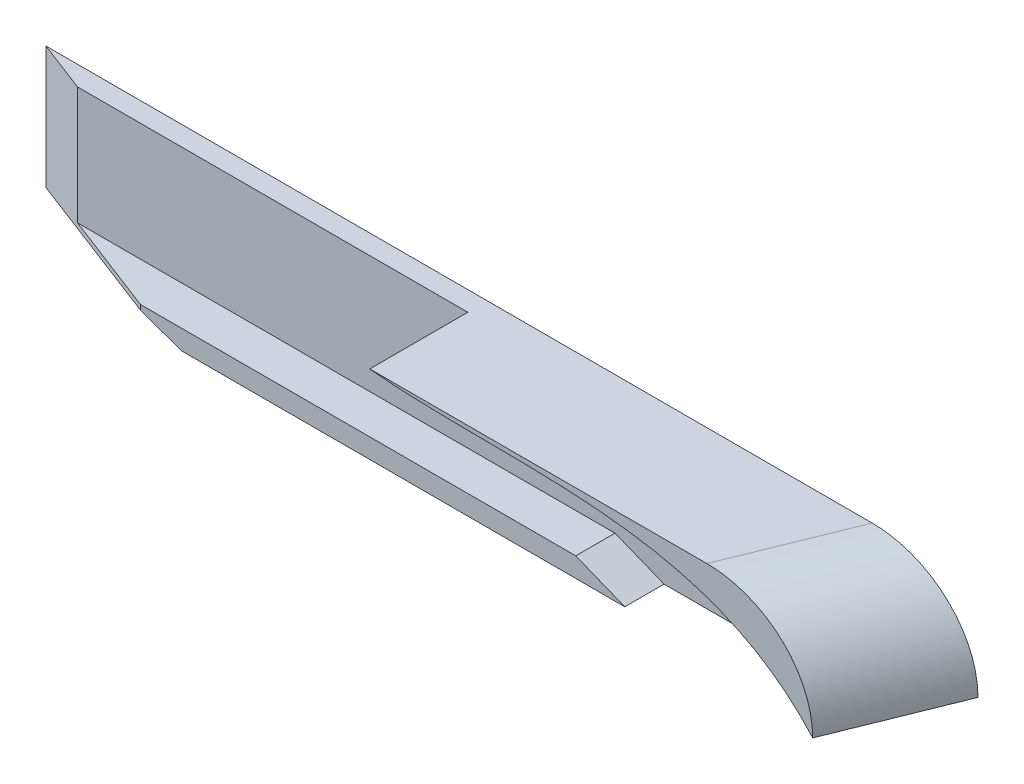
ISO-10303-21;
HEADER;
FILE_DESCRIPTION(('STEP AP214'),'2;1');
FILE_NAME('part.step','',(''),(''),'','','');
FILE_SCHEMA(('AUTOMOTIVE_DESIGN { 1 0 10303 214 1 1 1 1 }'));
ENDSEC;
DATA;
#1=APPLICATION_CONTEXT('core data for automotive mechanical design processes');
#2=APPLICATION_PROTOCOL_DEFINITION('international standard','automotive_design',2000,#1);
#3=PRODUCT_CONTEXT('',#1,'mechanical');
#4=PRODUCT('Part','Part','',(#3));
#5=PRODUCT_RELATED_PRODUCT_CATEGORY('part','',(#4));
#6=PRODUCT_DEFINITION_FORMATION('','',#4);
#7=PRODUCT_DEFINITION_CONTEXT('part definition',#1,'design');
#8=PRODUCT_DEFINITION('design','',#6,#7);
#9=PRODUCT_DEFINITION_SHAPE('','',#8);
#10=(LENGTH_UNIT() NAMED_UNIT(*) SI_UNIT(.MILLI.,.METRE.));
#11=(NAMED_UNIT(*) PLANE_ANGLE_UNIT() SI_UNIT($,.RADIAN.));
#12=(NAMED_UNIT(*) SI_UNIT($,.STERADIAN.) SOLID_ANGLE_UNIT());
#13=UNCERTAINTY_MEASURE_WITH_UNIT(LENGTH_MEASURE(1.E-05),#10,'distance_accuracy_value','');
#14=(GEOMETRIC_REPRESENTATION_CONTEXT(3) GLOBAL_UNCERTAINTY_ASSIGNED_CONTEXT((#13)) GLOBAL_UNIT_ASSIGNED_CONTEXT((#10,
#11,#12)) REPRESENTATION_CONTEXT('',''));
#15=CARTESIAN_POINT('',(0.,0.,0.));
#16=DIRECTION('',(0.,0.,1.));
#17=DIRECTION('',(1.,0.,0.));
#18=AXIS2_PLACEMENT_3D('',#15,#16,#17);
#19=CARTESIAN_POINT('',(32.9411764705883,11.906862745098,2.));
#20=DIRECTION('',(-1.,0.,0.));
#21=DIRECTION('',(0.,0.,1.));
#22=AXIS2_PLACEMENT_3D('',#19,#20,#21);
#23=PLANE('',#22);
#24=DIRECTION('',(0.,0.,-1.));
#25=VECTOR('',#24,1.);
#26=CARTESIAN_POINT('',(32.9411764705883,1.90686274509804,2.));
#27=LINE('',#26,#25);
#28=CARTESIAN_POINT('',(32.9411764705883,1.90686274509804,2.));
#29=VERTEX_POINT('',#28);
#30=CARTESIAN_POINT('',(32.9411764705883,1.90686274509804,0.));
#31=VERTEX_POINT('',#30);
#32=EDGE_CURVE('E171',#29,#31,#27,.T.);
#33=ORIENTED_EDGE('',*,*,#32,.F.);
#34=DIRECTION('',(0.,1.,0.));
#35=VECTOR('',#34,1.);
#36=CARTESIAN_POINT('',(32.9411764705883,11.906862745098,2.));
#37=LINE('',#36,#35);
#38=CARTESIAN_POINT('',(32.9411764705883,-2.09313725490196,2.));
#39=VERTEX_POINT('',#38);
#40=EDGE_CURVE('E132',#39,#29,#37,.T.);
#41=ORIENTED_EDGE('',*,*,#40,.F.);
#42=DIRECTION('',(0.,0.,-1.));
#43=VECTOR('',#42,1.);
#44=CARTESIAN_POINT('',(32.9411764705883,-2.09313725490196,2.));
#45=LINE('',#44,#43);
#46=CARTESIAN_POINT('',(32.9411764705883,-2.09313725490196,0.));
#47=VERTEX_POINT('',#46);
#48=EDGE_CURVE('E198',#39,#47,#45,.T.);
#49=ORIENTED_EDGE('',*,*,#48,.T.);
#50=DIRECTION('',(0.,1.,0.));
#51=VECTOR('',#50,1.);
#52=CARTESIAN_POINT('',(32.9411764705883,11.906862745098,0.));
#53=LINE('',#52,#51);
#54=EDGE_CURVE('E203',#47,#31,#53,.T.);
#55=ORIENTED_EDGE('',*,*,#54,.T.);
#56=EDGE_LOOP('',(#33,#41,#49,#55));
#57=FACE_BOUND('',#56,.T.);
#58=ADVANCED_FACE('F41',(#57),#23,.F.);
#59=CARTESIAN_POINT('',(0.,0.,2.));
#60=DIRECTION('',(0.,0.,1.));
#61=DIRECTION('',(1.,0.,0.));
#62=AXIS2_PLACEMENT_3D('',#59,#60,#61);
#63=PLANE('',#62);
#64=ORIENTED_EDGE('',*,*,#40,.T.);
#65=DIRECTION('',(1.,0.,0.));
#66=VECTOR('',#65,1.);
#67=CARTESIAN_POINT('',(-7.05882352941175,1.90686274509804,2.));
#68=LINE('',#67,#66);
#69=CARTESIAN_POINT('',(38.0928617605664,1.90686274509804,2.));
#70=VERTEX_POINT('',#69);
#71=EDGE_CURVE('E126',#29,#70,#68,.T.);
#72=ORIENTED_EDGE('',*,*,#71,.T.);
#73=CARTESIAN_POINT('',(38.0928617605664,1.90686274509804,2.));
#74=CARTESIAN_POINT('',(26.9851714779001,14.4167580625328,2.));
#75=CARTESIAN_POINT('',(7.59742467284793,10.4161931642918,2.));
#76=CARTESIAN_POINT('',(-7.05882352941175,11.906862745098,2.));
#77=B_SPLINE_CURVE_WITH_KNOTS('',3,(#73,#74,#75,#76),.UNSPECIFIED.,.F.,.F.,(4,4),(0.,1.),.UNSPECIFIED.);
#78=CARTESIAN_POINT('',(-7.05882352941175,11.906862745098,2.));
#79=VERTEX_POINT('',#78);
#80=EDGE_CURVE('E129',#70,#79,#77,.T.);
#81=ORIENTED_EDGE('',*,*,#80,.T.);
#82=DIRECTION('',(-1.,0.,0.));
#83=VECTOR('',#82,1.);
#84=CARTESIAN_POINT('',(-52.0588235294118,11.906862745098,2.));
#85=LINE('',#84,#83);
#86=CARTESIAN_POINT('',(-46.8486454000241,11.906862745098,2.));
#87=VERTEX_POINT('',#86);
#88=EDGE_CURVE('E195',#79,#87,#85,.T.);
#89=ORIENTED_EDGE('',*,*,#88,.T.);
#90=DIRECTION('',(0.,1.,0.));
#91=VECTOR('',#90,1.);
#92=CARTESIAN_POINT('',(-46.8486454000241,0.,2.));
#93=LINE('',#92,#91);
#94=CARTESIAN_POINT('',(-46.8486454000241,-0.0931372549019607,2.));
#95=VERTEX_POINT('',#94);
#96=EDGE_CURVE('E162',#95,#87,#93,.T.);
#97=ORIENTED_EDGE('',*,*,#96,.F.);
#98=DIRECTION('',(1.,0.,0.));
#99=VECTOR('',#98,1.);
#100=CARTESIAN_POINT('',(0.,-0.0931372549019607,2.));
#101=LINE('',#100,#99);
#102=CARTESIAN_POINT('',(7.94117647058825,-0.0931372549019607,2.));
#103=VERTEX_POINT('',#102);
#104=EDGE_CURVE('E191',#95,#103,#101,.T.);
#105=ORIENTED_EDGE('',*,*,#104,.T.);
#106=DIRECTION('',(0.928476690885259,-0.371390676354104,0.));
#107=VECTOR('',#106,1.);
#108=CARTESIAN_POINT('',(7.94117647058825,-0.0931372549019607,2.));
#109=LINE('',#108,#107);
#110=CARTESIAN_POINT('',(12.9411764705883,-2.09313725490196,2.));
#111=VERTEX_POINT('',#110);
#112=EDGE_CURVE('E174',#103,#111,#109,.T.);
#113=ORIENTED_EDGE('',*,*,#112,.T.);
#114=DIRECTION('',(1.,0.,0.));
#115=VECTOR('',#114,1.);
#116=CARTESIAN_POINT('',(12.9411764705883,-2.09313725490196,2.));
#117=LINE('',#116,#115);
#118=EDGE_CURVE('E177',#111,#39,#117,.T.);
#119=ORIENTED_EDGE('',*,*,#118,.T.);
#120=EDGE_LOOP('',(#64,#72,#81,#89,#97,#105,#113,#119));
#121=FACE_BOUND('',#120,.T.);
#122=ADVANCED_FACE('F128',(#121),#63,.T.);
#123=CARTESIAN_POINT('',(-52.0588235294118,-2.09313725490196,2.));
#124=DIRECTION('',(0.,1.,0.));
#125=DIRECTION('',(0.,0.,1.));
#126=AXIS2_PLACEMENT_3D('',#123,#124,#125);
#127=PLANE('',#126);
#128=DIRECTION('',(1.,0.,0.));
#129=VECTOR('',#128,1.);
#130=CARTESIAN_POINT('',(-52.0588235294118,-2.09313725490196,6.));
#131=LINE('',#130,#129);
#132=CARTESIAN_POINT('',(-32.2426469768106,-2.09313725490196,6.));
#133=VERTEX_POINT('',#132);
#134=CARTESIAN_POINT('',(12.9411764705883,-2.09313725490196,6.));
#135=VERTEX_POINT('',#134);
#136=EDGE_CURVE('E185',#133,#135,#131,.T.);
#137=ORIENTED_EDGE('',*,*,#136,.F.);
#138=DIRECTION('',(-0.933580426497204,0.,-0.358367949545295));
#139=VECTOR('',#138,1.);
#140=CARTESIAN_POINT('',(-50.852140998735,-2.09313725490196,-1.14351546522322));
#141=LINE('',#140,#139);
#142=CARTESIAN_POINT('',(-47.8731813649737,-2.09313725490196,0.));
#143=VERTEX_POINT('',#142);
#144=EDGE_CURVE('E216',#133,#143,#141,.T.);
#145=ORIENTED_EDGE('',*,*,#144,.T.);
#146=DIRECTION('',(1.,0.,0.));
#147=VECTOR('',#146,1.);
#148=CARTESIAN_POINT('',(-52.0588235294118,-2.09313725490196,0.));
#149=LINE('',#148,#147);
#150=EDGE_CURVE('E201',#143,#47,#149,.T.);
#151=ORIENTED_EDGE('',*,*,#150,.T.);
#152=ORIENTED_EDGE('',*,*,#48,.F.);
#153=ORIENTED_EDGE('',*,*,#118,.F.);
#154=DIRECTION('',(0.,0.,1.));
#155=VECTOR('',#154,1.);
#156=CARTESIAN_POINT('',(12.9411764705883,-2.09313725490196,2.));
#157=LINE('',#156,#155);
#158=EDGE_CURVE('E182',#111,#135,#157,.T.);
#159=ORIENTED_EDGE('',*,*,#158,.T.);
#160=EDGE_LOOP('',(#137,#145,#151,#152,#153,#159));
#161=FACE_BOUND('',#160,.T.);
#162=ADVANCED_FACE('F249',(#161),#127,.F.);
#163=CARTESIAN_POINT('',(-52.0588235294118,11.906862745098,2.));
#164=DIRECTION('',(0.,-1.,0.));
#165=DIRECTION('',(0.,0.,-1.));
#166=AXIS2_PLACEMENT_3D('',#163,#164,#165);
#167=PLANE('',#166);
#168=DIRECTION('',(1.,0.,0.));
#169=VECTOR('',#168,1.);
#170=CARTESIAN_POINT('',(-7.05882352941175,11.906862745098,12.));
#171=LINE('',#170,#169);
#172=CARTESIAN_POINT('',(-7.05882352941175,11.906862745098,12.));
#173=VERTEX_POINT('',#172);
#174=CARTESIAN_POINT('',(27.3075143337906,11.906862745098,12.));
#175=VERTEX_POINT('',#174);
#176=EDGE_CURVE('E157',#173,#175,#171,.T.);
#177=ORIENTED_EDGE('',*,*,#176,.T.);
#178=DIRECTION('',(0.37460659341591,0.,-0.927183854566788));
#179=VECTOR('',#178,1.);
#180=CARTESIAN_POINT('',(19.6433200705475,11.906862745098,30.9695464629818));
#181=LINE('',#180,#179);
#182=CARTESIAN_POINT('',(32.1558290438124,11.906862745098,0.));
#183=VERTEX_POINT('',#182);
#184=EDGE_CURVE('E220',#175,#183,#181,.T.);
#185=ORIENTED_EDGE('',*,*,#184,.T.);
#186=DIRECTION('',(-1.,0.,0.));
#187=VECTOR('',#186,1.);
#188=CARTESIAN_POINT('',(-52.0588235294118,11.906862745098,0.));
#189=LINE('',#188,#187);
#190=CARTESIAN_POINT('',(-52.0588235294118,11.906862745098,0.));
#191=VERTEX_POINT('',#190);
#192=EDGE_CURVE('E196',#183,#191,#189,.T.);
#193=ORIENTED_EDGE('',*,*,#192,.T.);
#194=DIRECTION('',(0.933580426497204,0.,0.358367949545295));
#195=VECTOR('',#194,1.);
#196=CARTESIAN_POINT('',(-51.3896929230529,11.906862745098,0.256855174522597));
#197=LINE('',#196,#195);
#198=EDGE_CURVE('E165',#191,#87,#197,.T.);
#199=ORIENTED_EDGE('',*,*,#198,.T.);
#200=ORIENTED_EDGE('',*,*,#88,.F.);
#201=DIRECTION('',(0.,0.,1.));
#202=VECTOR('',#201,1.);
#203=CARTESIAN_POINT('',(-7.05882352941175,11.906862745098,2.));
#204=LINE('',#203,#202);
#205=EDGE_CURVE('E142',#79,#173,#204,.T.);
#206=ORIENTED_EDGE('',*,*,#205,.T.);
#207=EDGE_LOOP('',(#177,#185,#193,#199,#200,#206));
#208=FACE_BOUND('',#207,.T.);
#209=ADVANCED_FACE('F227',(#208),#167,.F.);
#210=CARTESIAN_POINT('',(0.,0.,0.));
#211=DIRECTION('',(0.,0.,1.));
#212=DIRECTION('',(1.,0.,0.));
#213=AXIS2_PLACEMENT_3D('',#210,#211,#212);
#214=PLANE('',#213);
#215=ORIENTED_EDGE('',*,*,#192,.F.);
#216=CARTESIAN_POINT('',(32.1558290438124,1.90686274509804,0.));
#217=DIRECTION('',(0.,0.,1.));
#218=DIRECTION('',(1.,0.,0.));
#219=AXIS2_PLACEMENT_3D('',#216,#217,#218);
#220=ELLIPSE('',#219,10.7853474267758,10.);
#221=CARTESIAN_POINT('',(42.9411764705883,1.90686274509804,0.));
#222=VERTEX_POINT('',#221);
#223=EDGE_CURVE('E49',#183,#222,#220,.F.);
#224=ORIENTED_EDGE('',*,*,#223,.T.);
#225=DIRECTION('',(-1.,0.,0.));
#226=VECTOR('',#225,1.);
#227=CARTESIAN_POINT('',(32.9411764705883,1.90686274509804,0.));
#228=LINE('',#227,#226);
#229=EDGE_CURVE('E168',#222,#31,#228,.T.);
#230=ORIENTED_EDGE('',*,*,#229,.T.);
#231=ORIENTED_EDGE('',*,*,#54,.F.);
#232=ORIENTED_EDGE('',*,*,#150,.F.);
#233=DIRECTION('',(0.941376066179338,-0.337359010587703,0.));
#234=VECTOR('',#233,1.);
#235=CARTESIAN_POINT('',(-52.0588235294118,-0.593137254901961,0.));
#236=LINE('',#235,#234);
#237=CARTESIAN_POINT('',(-52.0588235294118,-0.593137254901963,0.));
#238=VERTEX_POINT('',#237);
#239=EDGE_CURVE('E218',#143,#238,#236,.F.);
#240=ORIENTED_EDGE('',*,*,#239,.T.);
#241=DIRECTION('',(0.,-1.,0.));
#242=VECTOR('',#241,1.);
#243=CARTESIAN_POINT('',(-52.0588235294118,11.906862745098,0.));
#244=LINE('',#243,#242);
#245=EDGE_CURVE('E193',#191,#238,#244,.T.);
#246=ORIENTED_EDGE('',*,*,#245,.F.);
#247=EDGE_LOOP('',(#215,#224,#230,#231,#232,#240,#246));
#248=FACE_BOUND('',#247,.T.);
#249=ADVANCED_FACE('F223',(#248),#214,.F.);
#250=CARTESIAN_POINT('',(-52.0588235294118,-0.0931372549019607,6.));
#251=DIRECTION('',(0.,-1.,0.));
#252=DIRECTION('',(0.,0.,-1.));
#253=AXIS2_PLACEMENT_3D('',#250,#251,#252);
#254=PLANE('',#253);
#255=ORIENTED_EDGE('',*,*,#104,.F.);
#256=DIRECTION('',(0.933580426497204,0.,0.358367949545295));
#257=VECTOR('',#256,1.);
#258=CARTESIAN_POINT('',(-50.0514317103352,-0.0931372549019607,0.770565523567792));
#259=LINE('',#258,#257);
#260=CARTESIAN_POINT('',(-36.4282891412487,-0.0931372549019607,6.));
#261=VERTEX_POINT('',#260);
#262=EDGE_CURVE('E159',#95,#261,#259,.T.);
#263=ORIENTED_EDGE('',*,*,#262,.T.);
#264=DIRECTION('',(-1.,0.,0.));
#265=VECTOR('',#264,1.);
#266=CARTESIAN_POINT('',(-52.0588235294118,-0.0931372549019607,6.));
#267=LINE('',#266,#265);
#268=CARTESIAN_POINT('',(7.94117647058825,-0.0931372549019607,6.));
#269=VERTEX_POINT('',#268);
#270=EDGE_CURVE('E188',#269,#261,#267,.T.);
#271=ORIENTED_EDGE('',*,*,#270,.F.);
#272=DIRECTION('',(0.,0.,1.));
#273=VECTOR('',#272,1.);
#274=CARTESIAN_POINT('',(7.94117647058825,-0.0931372549019607,2.));
#275=LINE('',#274,#273);
#276=EDGE_CURVE('E179',#103,#269,#275,.T.);
#277=ORIENTED_EDGE('',*,*,#276,.F.);
#278=EDGE_LOOP('',(#255,#263,#271,#277));
#279=FACE_BOUND('',#278,.T.);
#280=ADVANCED_FACE('F278',(#279),#254,.F.);
#281=CARTESIAN_POINT('',(0.,0.,6.));
#282=DIRECTION('',(0.,0.,-1.));
#283=DIRECTION('',(-1.,0.,0.));
#284=AXIS2_PLACEMENT_3D('',#281,#282,#283);
#285=PLANE('',#284);
#286=DIRECTION('',(0.,-1.,0.));
#287=VECTOR('',#286,1.);
#288=CARTESIAN_POINT('',(-36.4282891412487,0.,6.));
#289=LINE('',#288,#287);
#290=CARTESIAN_POINT('',(-36.4282891412487,-0.593137254901962,6.));
#291=VERTEX_POINT('',#290);
#292=EDGE_CURVE('E208',#261,#291,#289,.T.);
#293=ORIENTED_EDGE('',*,*,#292,.T.);
#294=DIRECTION('',(-0.941376066179338,0.337359010587703,0.));
#295=VECTOR('',#294,1.);
#296=CARTESIAN_POINT('',(-50.2798951854597,4.37083440107114,6.));
#297=LINE('',#296,#295);
#298=EDGE_CURVE('E214',#291,#133,#297,.F.);
#299=ORIENTED_EDGE('',*,*,#298,.T.);
#300=ORIENTED_EDGE('',*,*,#136,.T.);
#301=DIRECTION('',(0.928476690885259,-0.371390676354104,0.));
#302=VECTOR('',#301,1.);
#303=CARTESIAN_POINT('',(7.94117647058825,-0.0931372549019607,6.));
#304=LINE('',#303,#302);
#305=EDGE_CURVE('E173',#269,#135,#304,.T.);
#306=ORIENTED_EDGE('',*,*,#305,.F.);
#307=ORIENTED_EDGE('',*,*,#270,.T.);
#308=EDGE_LOOP('',(#293,#299,#300,#306,#307));
#309=FACE_BOUND('',#308,.T.);
#310=ADVANCED_FACE('F282',(#309),#285,.F.);
#311=CARTESIAN_POINT('',(7.94117647058825,-0.0931372549019607,2.));
#312=DIRECTION('',(-0.371390676354104,-0.928476690885259,0.));
#313=DIRECTION('',(0.928476690885259,-0.371390676354104,0.));
#314=AXIS2_PLACEMENT_3D('',#311,#312,#313);
#315=PLANE('',#314);
#316=ORIENTED_EDGE('',*,*,#305,.T.);
#317=ORIENTED_EDGE('',*,*,#158,.F.);
#318=ORIENTED_EDGE('',*,*,#112,.F.);
#319=ORIENTED_EDGE('',*,*,#276,.T.);
#320=EDGE_LOOP('',(#316,#317,#318,#319));
#321=FACE_BOUND('',#320,.T.);
#322=ADVANCED_FACE('F281',(#321),#315,.F.);
#323=CARTESIAN_POINT('',(32.9411764705883,1.90686274509804,2.));
#324=DIRECTION('',(0.,-1.,0.));
#325=DIRECTION('',(1.,0.,0.));
#326=AXIS2_PLACEMENT_3D('',#323,#324,#325);
#327=PLANE('',#326);
#328=DIRECTION('',(0.,0.,1.));
#329=VECTOR('',#328,1.);
#330=CARTESIAN_POINT('',(38.0928617605664,1.90686274509804,2.));
#331=LINE('',#330,#329);
#332=CARTESIAN_POINT('',(38.0928617605664,1.90686274509804,12.));
#333=VERTEX_POINT('',#332);
#334=EDGE_CURVE('E137',#70,#333,#331,.T.);
#335=ORIENTED_EDGE('',*,*,#334,.F.);
#336=ORIENTED_EDGE('',*,*,#71,.F.);
#337=ORIENTED_EDGE('',*,*,#32,.T.);
#338=ORIENTED_EDGE('',*,*,#229,.F.);
#339=DIRECTION('',(0.37460659341591,0.,-0.927183854566788));
#340=VECTOR('',#339,1.);
#341=CARTESIAN_POINT('',(42.9411764705883,1.90686274509804,0.));
#342=LINE('',#341,#340);
#343=EDGE_CURVE('E149',#333,#222,#342,.T.);
#344=ORIENTED_EDGE('',*,*,#343,.F.);
#345=EDGE_LOOP('',(#335,#336,#337,#338,#344));
#346=FACE_BOUND('',#345,.T.);
#347=ADVANCED_FACE('F147',(#346),#327,.T.);
#348=CARTESIAN_POINT('',(-52.0588235294118,17.906862745098,0.));
#349=DIRECTION('',(0.358367949545295,0.,-0.933580426497204));
#350=DIRECTION('',(-0.933580426497204,0.,-0.358367949545295));
#351=AXIS2_PLACEMENT_3D('',#348,#349,#350);
#352=PLANE('',#351);
#353=ORIENTED_EDGE('',*,*,#245,.T.);
#354=DIRECTION('',(0.933580426497204,0.,0.358367949545295));
#355=VECTOR('',#354,1.);
#356=CARTESIAN_POINT('',(-52.0588235294118,-0.593137254901961,0.));
#357=LINE('',#356,#355);
#358=EDGE_CURVE('E211',#238,#291,#357,.T.);
#359=ORIENTED_EDGE('',*,*,#358,.T.);
#360=ORIENTED_EDGE('',*,*,#292,.F.);
#361=ORIENTED_EDGE('',*,*,#262,.F.);
#362=ORIENTED_EDGE('',*,*,#96,.T.);
#363=ORIENTED_EDGE('',*,*,#198,.F.);
#364=EDGE_LOOP('',(#353,#359,#360,#361,#362,#363));
#365=FACE_BOUND('',#364,.T.);
#366=ADVANCED_FACE('F238',(#365),#352,.F.);
#367=CARTESIAN_POINT('',(-52.0588235294118,-0.593137254901961,0.));
#368=DIRECTION('',(0.253404407283396,0.707106781186549,-0.6601410503592));
#369=DIRECTION('',(0.933580426497204,0.,0.358367949545295));
#370=AXIS2_PLACEMENT_3D('',#367,#368,#369);
#371=PLANE('',#370);
#372=ORIENTED_EDGE('',*,*,#239,.F.);
#373=ORIENTED_EDGE('',*,*,#144,.F.);
#374=ORIENTED_EDGE('',*,*,#298,.F.);
#375=ORIENTED_EDGE('',*,*,#358,.F.);
#376=EDGE_LOOP('',(#372,#373,#374,#375));
#377=FACE_BOUND('',#376,.T.);
#378=ADVANCED_FACE('F231',(#377),#371,.F.);
#379=CARTESIAN_POINT('',(-7.05882352941175,11.906862745098,12.));
#380=DIRECTION('',(0.,0.,1.));
#381=DIRECTION('',(0.,-1.,0.));
#382=AXIS2_PLACEMENT_3D('',#379,#380,#381);
#383=PLANE('',#382);
#384=CARTESIAN_POINT('',(38.0928617605664,1.90686274509804,12.));
#385=CARTESIAN_POINT('',(26.9851714779001,14.4167580625328,12.));
#386=CARTESIAN_POINT('',(7.59742467284793,10.4161931642918,12.));
#387=CARTESIAN_POINT('',(-7.05882352941175,11.906862745098,12.));
#388=B_SPLINE_CURVE_WITH_KNOTS('',3,(#384,#385,#386,#387),.UNSPECIFIED.,.F.,.F.,(4,4),(0.,1.),.UNSPECIFIED.);
#389=EDGE_CURVE('E144',#333,#173,#388,.T.);
#390=ORIENTED_EDGE('',*,*,#389,.F.);
#391=CARTESIAN_POINT('',(27.3075143337906,1.90686274509804,12.));
#392=DIRECTION('',(0.,0.,1.));
#393=DIRECTION('',(1.,0.,0.));
#394=AXIS2_PLACEMENT_3D('',#391,#392,#393);
#395=ELLIPSE('',#394,10.7853474267758,10.);
#396=EDGE_CURVE('E11',#333,#175,#395,.T.);
#397=ORIENTED_EDGE('',*,*,#396,.T.);
#398=ORIENTED_EDGE('',*,*,#176,.F.);
#399=EDGE_LOOP('',(#390,#397,#398));
#400=FACE_BOUND('',#399,.T.);
#401=ADVANCED_FACE('F229',(#400),#383,.T.);
#402=CARTESIAN_POINT('',(19.6433200705475,1.90686274509804,30.9695464629818));
#403=DIRECTION('',(0.37460659341591,0.,-0.927183854566788));
#404=DIRECTION('',(-0.927183854566788,0.,-0.37460659341591));
#405=AXIS2_PLACEMENT_3D('',#402,#403,#404);
#406=CYLINDRICAL_SURFACE('',#405,10.);
#407=ORIENTED_EDGE('',*,*,#396,.F.);
#408=ORIENTED_EDGE('',*,*,#343,.T.);
#409=ORIENTED_EDGE('',*,*,#223,.F.);
#410=ORIENTED_EDGE('',*,*,#184,.F.);
#411=EDGE_LOOP('',(#407,#408,#409,#410));
#412=FACE_BOUND('',#411,.T.);
#413=ADVANCED_FACE('F43',(#412),#406,.T.);
#414=DIRECTION('',(0.,0.,1.));
#415=VECTOR('',#414,1.);
#416=SURFACE_OF_LINEAR_EXTRUSION('',#77,#415);
#417=ORIENTED_EDGE('',*,*,#389,.T.);
#418=ORIENTED_EDGE('',*,*,#205,.F.);
#419=ORIENTED_EDGE('',*,*,#80,.F.);
#420=ORIENTED_EDGE('',*,*,#334,.T.);
#421=EDGE_LOOP('',(#417,#418,#419,#420));
#422=FACE_BOUND('',#421,.T.);
#423=ADVANCED_FACE('F140',(#422),#416,.F.);
#424=CLOSED_SHELL('',(#58,#122,#162,#209,#249,#280,#310,#322,#347,#366,#378,#401,#413,#423));
#425=MANIFOLD_SOLID_BREP('B2',#424);
#426=ADVANCED_BREP_SHAPE_REPRESENTATION('',(#18,#425),#14);
#427=SHAPE_DEFINITION_REPRESENTATION(#9,#426);
ENDSEC;
END-ISO-10303-21;
